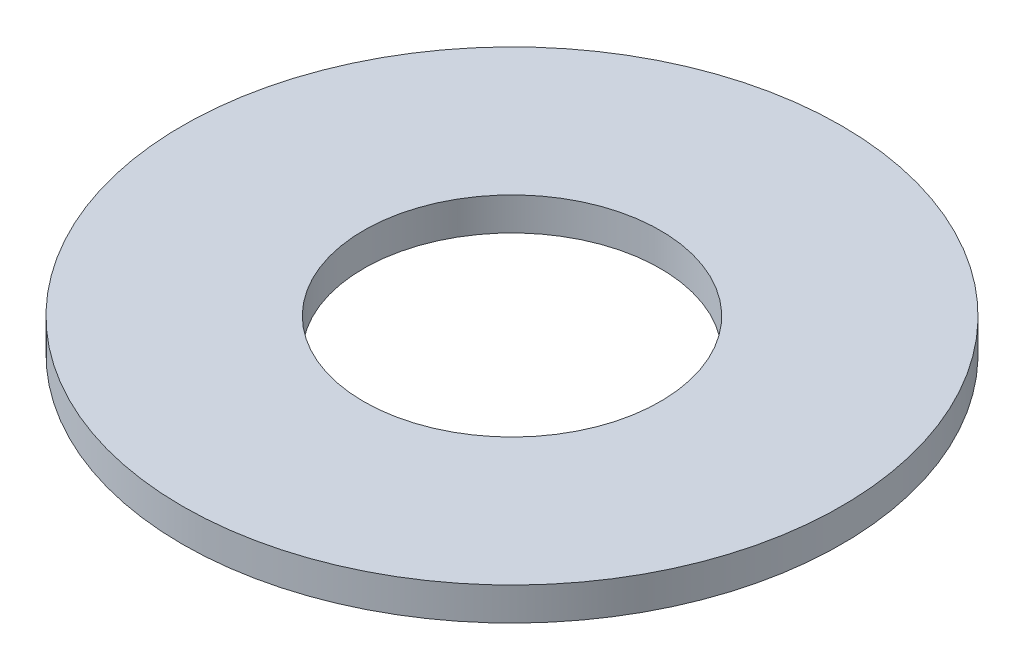
ISO-10303-21;
HEADER;
FILE_DESCRIPTION(('STEP AP214'),'2;1');
FILE_NAME('part.step','',(''),(''),'','','');
FILE_SCHEMA(('AUTOMOTIVE_DESIGN { 1 0 10303 214 1 1 1 1 }'));
ENDSEC;
DATA;
#1=APPLICATION_CONTEXT('core data for automotive mechanical design processes');
#2=APPLICATION_PROTOCOL_DEFINITION('international standard','automotive_design',2000,#1);
#3=PRODUCT_CONTEXT('',#1,'mechanical');
#4=PRODUCT('Part','Part','',(#3));
#5=PRODUCT_RELATED_PRODUCT_CATEGORY('part','',(#4));
#6=PRODUCT_DEFINITION_FORMATION('','',#4);
#7=PRODUCT_DEFINITION_CONTEXT('part definition',#1,'design');
#8=PRODUCT_DEFINITION('design','',#6,#7);
#9=PRODUCT_DEFINITION_SHAPE('','',#8);
#10=(LENGTH_UNIT() NAMED_UNIT(*) SI_UNIT(.MILLI.,.METRE.));
#11=(NAMED_UNIT(*) PLANE_ANGLE_UNIT() SI_UNIT($,.RADIAN.));
#12=(NAMED_UNIT(*) SI_UNIT($,.STERADIAN.) SOLID_ANGLE_UNIT());
#13=UNCERTAINTY_MEASURE_WITH_UNIT(LENGTH_MEASURE(1.E-05),#10,'distance_accuracy_value','');
#14=(GEOMETRIC_REPRESENTATION_CONTEXT(3) GLOBAL_UNCERTAINTY_ASSIGNED_CONTEXT((#13)) GLOBAL_UNIT_ASSIGNED_CONTEXT((#10,
#11,#12)) REPRESENTATION_CONTEXT('',''));
#15=CARTESIAN_POINT('',(0.,0.,0.));
#16=DIRECTION('',(0.,0.,1.));
#17=DIRECTION('',(1.,0.,0.));
#18=AXIS2_PLACEMENT_3D('',#15,#16,#17);
#19=CARTESIAN_POINT('',(0.,0.5,0.));
#20=DIRECTION('',(0.,1.,0.));
#21=DIRECTION('',(0.,0.,1.));
#22=AXIS2_PLACEMENT_3D('',#19,#20,#21);
#23=PLANE('',#22);
#24=CARTESIAN_POINT('',(0.,0.5,0.));
#25=DIRECTION('',(0.,1.,0.));
#26=DIRECTION('',(0.,0.,1.));
#27=AXIS2_PLACEMENT_3D('',#24,#25,#26);
#28=CIRCLE('',#27,5.);
#29=CARTESIAN_POINT('',(0.,0.5,5.));
#30=VERTEX_POINT('',#29);
#31=EDGE_CURVE('E10',#30,#30,#28,.T.);
#32=ORIENTED_EDGE('',*,*,#31,.T.);
#33=EDGE_LOOP('',(#32));
#34=FACE_BOUND('',#33,.T.);
#35=CARTESIAN_POINT('',(0.,0.5,0.));
#36=DIRECTION('',(0.,1.,0.));
#37=DIRECTION('',(0.,0.,1.));
#38=AXIS2_PLACEMENT_3D('',#35,#36,#37);
#39=CIRCLE('',#38,2.25);
#40=CARTESIAN_POINT('',(0.,0.5,2.25));
#41=VERTEX_POINT('',#40);
#42=EDGE_CURVE('E56',#41,#41,#39,.T.);
#43=ORIENTED_EDGE('',*,*,#42,.F.);
#44=EDGE_LOOP('',(#43));
#45=FACE_BOUND('',#44,.T.);
#46=ADVANCED_FACE('F43',(#34,#45),#23,.T.);
#47=CARTESIAN_POINT('',(0.,0.,0.));
#48=DIRECTION('',(0.,1.,0.));
#49=DIRECTION('',(0.,0.,1.));
#50=AXIS2_PLACEMENT_3D('',#47,#48,#49);
#51=PLANE('',#50);
#52=CARTESIAN_POINT('',(0.,0.,0.));
#53=DIRECTION('',(0.,1.,0.));
#54=DIRECTION('',(0.,0.,1.));
#55=AXIS2_PLACEMENT_3D('',#52,#53,#54);
#56=CIRCLE('',#55,5.);
#57=CARTESIAN_POINT('',(0.,0.,5.));
#58=VERTEX_POINT('',#57);
#59=EDGE_CURVE('E47',#58,#58,#56,.T.);
#60=ORIENTED_EDGE('',*,*,#59,.F.);
#61=EDGE_LOOP('',(#60));
#62=FACE_BOUND('',#61,.T.);
#63=CARTESIAN_POINT('',(0.,0.,0.));
#64=DIRECTION('',(0.,1.,0.));
#65=DIRECTION('',(0.,0.,1.));
#66=AXIS2_PLACEMENT_3D('',#63,#64,#65);
#67=CIRCLE('',#66,2.25);
#68=CARTESIAN_POINT('',(0.,0.,2.25));
#69=VERTEX_POINT('',#68);
#70=EDGE_CURVE('E58',#69,#69,#67,.T.);
#71=ORIENTED_EDGE('',*,*,#70,.T.);
#72=EDGE_LOOP('',(#71));
#73=FACE_BOUND('',#72,.T.);
#74=ADVANCED_FACE('F70',(#62,#73),#51,.F.);
#75=CARTESIAN_POINT('',(0.,0.5,0.));
#76=DIRECTION('',(0.,-1.,0.));
#77=DIRECTION('',(0.,0.,-1.));
#78=AXIS2_PLACEMENT_3D('',#75,#76,#77);
#79=CYLINDRICAL_SURFACE('',#78,5.);
#80=ORIENTED_EDGE('',*,*,#31,.F.);
#81=EDGE_LOOP('',(#80));
#82=FACE_BOUND('',#81,.T.);
#83=ORIENTED_EDGE('',*,*,#59,.T.);
#84=EDGE_LOOP('',(#83));
#85=FACE_BOUND('',#84,.T.);
#86=ADVANCED_FACE('F45',(#82,#85),#79,.T.);
#87=CARTESIAN_POINT('',(0.,0.5,0.));
#88=DIRECTION('',(0.,-1.,0.));
#89=DIRECTION('',(0.,0.,-1.));
#90=AXIS2_PLACEMENT_3D('',#87,#88,#89);
#91=CYLINDRICAL_SURFACE('',#90,2.25);
#92=ORIENTED_EDGE('',*,*,#42,.T.);
#93=EDGE_LOOP('',(#92));
#94=FACE_BOUND('',#93,.T.);
#95=ORIENTED_EDGE('',*,*,#70,.F.);
#96=EDGE_LOOP('',(#95));
#97=FACE_BOUND('',#96,.T.);
#98=ADVANCED_FACE('F66',(#94,#97),#91,.F.);
#99=CLOSED_SHELL('',(#46,#74,#86,#98));
#100=MANIFOLD_SOLID_BREP('B2',#99);
#101=ADVANCED_BREP_SHAPE_REPRESENTATION('',(#18,#100),#14);
#102=SHAPE_DEFINITION_REPRESENTATION(#9,#101);
ENDSEC;
END-ISO-10303-21;
